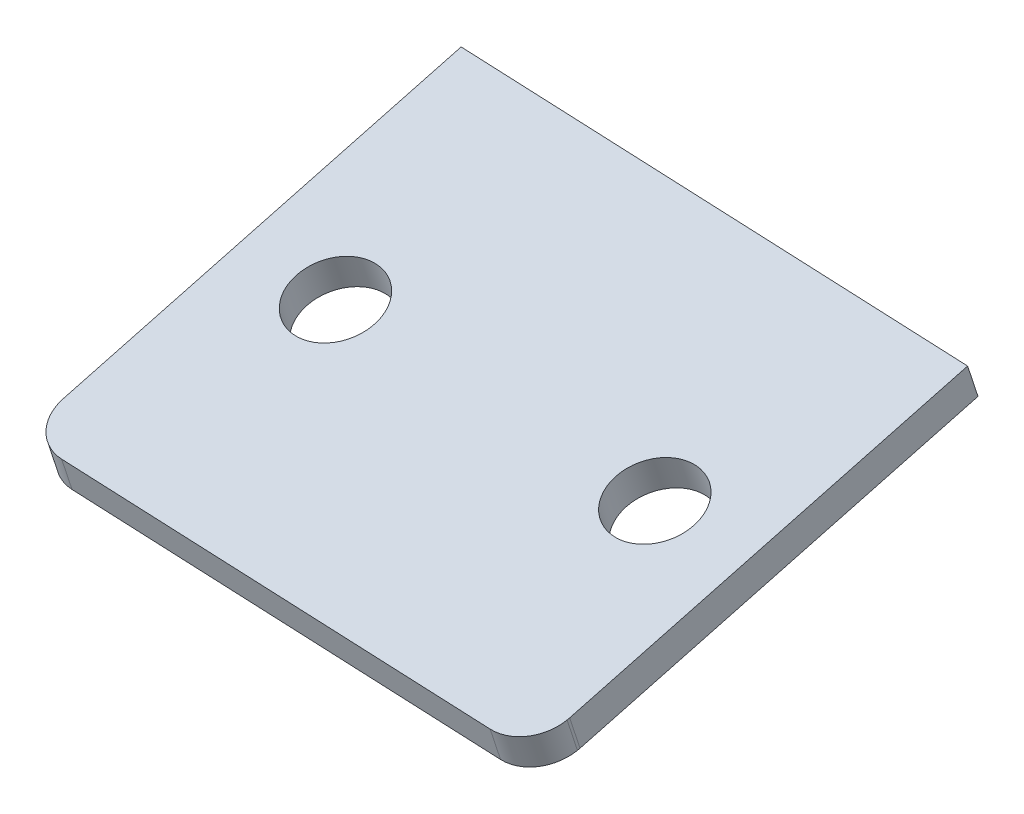
ISO-10303-21;
HEADER;
FILE_DESCRIPTION(('STEP AP214'),'2;1');
FILE_NAME('part.step','',(''),(''),'','','');
FILE_SCHEMA(('AUTOMOTIVE_DESIGN { 1 0 10303 214 1 1 1 1 }'));
ENDSEC;
DATA;
#1=APPLICATION_CONTEXT('core data for automotive mechanical design processes');
#2=APPLICATION_PROTOCOL_DEFINITION('international standard','automotive_design',2000,#1);
#3=PRODUCT_CONTEXT('',#1,'mechanical');
#4=PRODUCT('Part','Part','',(#3));
#5=PRODUCT_RELATED_PRODUCT_CATEGORY('part','',(#4));
#6=PRODUCT_DEFINITION_FORMATION('','',#4);
#7=PRODUCT_DEFINITION_CONTEXT('part definition',#1,'design');
#8=PRODUCT_DEFINITION('design','',#6,#7);
#9=PRODUCT_DEFINITION_SHAPE('','',#8);
#10=(LENGTH_UNIT() NAMED_UNIT(*) SI_UNIT(.MILLI.,.METRE.));
#11=(NAMED_UNIT(*) PLANE_ANGLE_UNIT() SI_UNIT($,.RADIAN.));
#12=(NAMED_UNIT(*) SI_UNIT($,.STERADIAN.) SOLID_ANGLE_UNIT());
#13=UNCERTAINTY_MEASURE_WITH_UNIT(LENGTH_MEASURE(1.E-05),#10,'distance_accuracy_value','');
#14=(GEOMETRIC_REPRESENTATION_CONTEXT(3) GLOBAL_UNCERTAINTY_ASSIGNED_CONTEXT((#13)) GLOBAL_UNIT_ASSIGNED_CONTEXT((#10,
#11,#12)) REPRESENTATION_CONTEXT('',''));
#15=CARTESIAN_POINT('',(0.,0.,0.));
#16=DIRECTION('',(0.,0.,1.));
#17=DIRECTION('',(1.,0.,0.));
#18=AXIS2_PLACEMENT_3D('',#15,#16,#17);
#19=CARTESIAN_POINT('',(20.554989204839,3.72280083406941,2.09203046891583));
#20=DIRECTION('',(0.999048221581858,0.,0.0436193873653291));
#21=DIRECTION('',(0.0436193873653291,0.,-0.999048221581858));
#22=AXIS2_PLACEMENT_3D('',#19,#20,#21);
#23=PLANE('',#22);
#24=DIRECTION('',(0.0415371984691524,0.305273862721688,-0.951358255276273));
#25=VECTOR('',#24,1.);
#26=CARTESIAN_POINT('',(20.5211669233077,6.14155291850395,2.86668807542055));
#27=LINE('',#26,#25);
#28=CARTESIAN_POINT('',(15.8520934976013,-28.1733776143081,109.806051146228));
#29=VERTEX_POINT('',#28);
#30=CARTESIAN_POINT('',(17.1476885624923,-18.6515195073833,80.132045534255));
#31=VERTEX_POINT('',#30);
#32=EDGE_CURVE('E142',#29,#31,#27,.T.);
#33=ORIENTED_EDGE('',*,*,#32,.F.);
#34=DIRECTION('',(-0.0133158588705677,0.952264600171076,0.304983309647527));
#35=VECTOR('',#34,1.);
#36=CARTESIAN_POINT('',(15.8859157791325,-30.5921296987427,109.031393539724));
#37=LINE('',#36,#35);
#38=CARTESIAN_POINT('',(15.8859157791325,-30.5921296987427,109.031393539724));
#39=VERTEX_POINT('',#38);
#40=EDGE_CURVE('E11',#39,#29,#37,.T.);
#41=ORIENTED_EDGE('',*,*,#40,.F.);
#42=DIRECTION('',(0.0415371984691524,0.305273862721688,-0.951358255276273));
#43=VECTOR('',#42,1.);
#44=CARTESIAN_POINT('',(20.554989204839,3.72280083406941,2.09203046891583));
#45=LINE('',#44,#43);
#46=CARTESIAN_POINT('',(17.1815108440235,-21.0702715918179,79.3573879277503));
#47=VERTEX_POINT('',#46);
#48=EDGE_CURVE('E165',#39,#47,#45,.T.);
#49=ORIENTED_EDGE('',*,*,#48,.T.);
#50=DIRECTION('',(-0.0133158588705677,0.952264600171076,0.304983309647527));
#51=VECTOR('',#50,1.);
#52=CARTESIAN_POINT('',(17.1815108440235,-21.0702715918179,79.3573879277503));
#53=LINE('',#52,#51);
#54=EDGE_CURVE('E94',#47,#31,#53,.T.);
#55=ORIENTED_EDGE('',*,*,#54,.T.);
#56=EDGE_LOOP('',(#33,#41,#49,#55));
#57=FACE_BOUND('',#56,.T.);
#58=ADVANCED_FACE('F43',(#57),#23,.T.);
#59=CARTESIAN_POINT('',(23.9557587514666,3.49686451625624,2.94596350866708));
#60=DIRECTION('',(-0.997298898666883,0.0093855284783371,-0.0728479139921318));
#61=DIRECTION('',(-0.0728511227229204,0.,0.997342826673963));
#62=AXIS2_PLACEMENT_3D('',#59,#60,#61);
#63=PLANE('',#62);
#64=DIRECTION('',(-0.0722329192291287,-0.305129551364994,0.949567460617431));
#65=VECTOR('',#64,1.);
#66=CARTESIAN_POINT('',(23.9219364699353,5.91561660069077,3.72062111517179));
#67=LINE('',#66,#65);
#68=CARTESIAN_POINT('',(15.837991585545,-28.2329475464806,109.991433614));
#69=VERTEX_POINT('',#68);
#70=EDGE_CURVE('E145',#29,#69,#67,.T.);
#71=ORIENTED_EDGE('',*,*,#70,.T.);
#72=DIRECTION('',(-0.0133158588705677,0.952264600171076,0.304983309647527));
#73=VECTOR('',#72,1.);
#74=CARTESIAN_POINT('',(15.8718138670763,-30.6516996309152,109.216776007496));
#75=LINE('',#74,#73);
#76=CARTESIAN_POINT('',(15.8718138670763,-30.6516996309152,109.216776007496));
#77=VERTEX_POINT('',#76);
#78=EDGE_CURVE('E51',#77,#69,#75,.T.);
#79=ORIENTED_EDGE('',*,*,#78,.F.);
#80=DIRECTION('',(-0.0722329192291287,-0.305129551364994,0.949567460617431));
#81=VECTOR('',#80,1.);
#82=CARTESIAN_POINT('',(23.9557587514666,3.49686451625624,2.94596350866708));
#83=LINE('',#82,#81);
#84=EDGE_CURVE('E194',#39,#77,#83,.T.);
#85=ORIENTED_EDGE('',*,*,#84,.F.);
#86=ORIENTED_EDGE('',*,*,#40,.T.);
#87=EDGE_LOOP('',(#71,#79,#85,#86));
#88=FACE_BOUND('',#87,.T.);
#89=ADVANCED_FACE('F198',(#88),#63,.F.);
#90=CARTESIAN_POINT('',(12.7139376756101,-30.5921296987426,108.892901984839));
#91=DIRECTION('',(-0.0133158588705677,0.952264600171076,0.304983309647527));
#92=DIRECTION('',(0.,-0.305010351858926,0.952349035416582));
#93=AXIS2_PLACEMENT_3D('',#90,#91,#92);
#94=CYLINDRICAL_SURFACE('',#93,3.175);
#95=CARTESIAN_POINT('',(12.6801153940789,-28.1733776143081,109.667559591343));
#96=DIRECTION('',(0.0133158588705676,-0.952264600171076,-0.304983309647527));
#97=DIRECTION('',(0.,0.305010351858926,-0.952349035416582));
#98=AXIS2_PLACEMENT_3D('',#95,#96,#97);
#99=CIRCLE('',#98,3.175);
#100=CARTESIAN_POINT('',(12.5482347889393,-29.1426221284494,112.688122051846));
#101=VERTEX_POINT('',#100);
#102=EDGE_CURVE('E147',#69,#101,#99,.T.);
#103=ORIENTED_EDGE('',*,*,#102,.T.);
#104=DIRECTION('',(-0.0133158588705677,0.952264600171076,0.304983309647527));
#105=VECTOR('',#104,1.);
#106=CARTESIAN_POINT('',(12.5820570704705,-31.561374212884,111.913464445341));
#107=LINE('',#106,#105);
#108=CARTESIAN_POINT('',(12.5820570704705,-31.561374212884,111.913464445341));
#109=VERTEX_POINT('',#108);
#110=EDGE_CURVE('E171',#109,#101,#107,.T.);
#111=ORIENTED_EDGE('',*,*,#110,.F.);
#112=CARTESIAN_POINT('',(12.7139376756101,-30.5921296987426,108.892901984839));
#113=DIRECTION('',(0.0133158588705676,-0.952264600171076,-0.304983309647527));
#114=DIRECTION('',(0.,0.305010351858926,-0.952349035416582));
#115=AXIS2_PLACEMENT_3D('',#112,#113,#114);
#116=CIRCLE('',#115,3.175);
#117=EDGE_CURVE('E180',#77,#109,#116,.T.);
#118=ORIENTED_EDGE('',*,*,#117,.F.);
#119=ORIENTED_EDGE('',*,*,#78,.T.);
#120=EDGE_LOOP('',(#103,#111,#118,#119));
#121=FACE_BOUND('',#120,.T.);
#122=ADVANCED_FACE('F178',(#121),#94,.T.);
#123=CARTESIAN_POINT('',(-4.85301129570791,-31.561374212884,111.152232920799));
#124=DIRECTION('',(0.0415371984691527,0.305273862721688,-0.951358255276273));
#125=DIRECTION('',(0.,0.952180026486865,0.305537554417576));
#126=AXIS2_PLACEMENT_3D('',#123,#124,#125);
#127=PLANE('',#126);
#128=DIRECTION('',(-0.999048221581858,0.,-0.0436193873653294));
#129=VECTOR('',#128,1.);
#130=CARTESIAN_POINT('',(-4.88683357723916,-29.1426221284494,111.926890527304));
#131=LINE('',#130,#129);
#132=CARTESIAN_POINT('',(-22.3219019434176,-29.1426221284494,111.165659002762));
#133=VERTEX_POINT('',#132);
#134=EDGE_CURVE('E149',#101,#133,#131,.T.);
#135=ORIENTED_EDGE('',*,*,#134,.T.);
#136=DIRECTION('',(-0.0133158588705677,0.952264600171076,0.304983309647527));
#137=VECTOR('',#136,1.);
#138=CARTESIAN_POINT('',(-22.2880796618863,-31.561374212884,110.391001396258));
#139=LINE('',#138,#137);
#140=CARTESIAN_POINT('',(-22.2880796618863,-31.561374212884,110.391001396258));
#141=VERTEX_POINT('',#140);
#142=EDGE_CURVE('E169',#141,#133,#139,.T.);
#143=ORIENTED_EDGE('',*,*,#142,.F.);
#144=DIRECTION('',(-0.999048221581858,0.,-0.0436193873653294));
#145=VECTOR('',#144,1.);
#146=CARTESIAN_POINT('',(-4.85301129570791,-31.561374212884,111.152232920799));
#147=LINE('',#146,#145);
#148=EDGE_CURVE('E192',#109,#141,#147,.T.);
#149=ORIENTED_EDGE('',*,*,#148,.F.);
#150=ORIENTED_EDGE('',*,*,#110,.T.);
#151=EDGE_LOOP('',(#135,#143,#149,#150));
#152=FACE_BOUND('',#151,.T.);
#153=ADVANCED_FACE('F190',(#152),#127,.F.);
#154=CARTESIAN_POINT('',(-22.1561990567468,-30.5921296987426,107.370438935755));
#155=DIRECTION('',(-0.0133158588705677,0.952264600171076,0.304983309647527));
#156=DIRECTION('',(0.,-0.305010351858926,0.952349035416582));
#157=AXIS2_PLACEMENT_3D('',#154,#155,#156);
#158=CYLINDRICAL_SURFACE('',#157,3.175);
#159=CARTESIAN_POINT('',(-22.190021338278,-28.1733776143081,108.14509654226));
#160=DIRECTION('',(0.0133158588705676,-0.952264600171076,-0.304983309647527));
#161=DIRECTION('',(0.,0.305010351858926,-0.952349035416582));
#162=AXIS2_PLACEMENT_3D('',#159,#160,#161);
#163=CIRCLE('',#162,3.175);
#164=CARTESIAN_POINT('',(-25.3641083384481,-28.2329475464808,108.192511081509));
#165=VERTEX_POINT('',#164);
#166=EDGE_CURVE('E152',#165,#133,#163,.F.);
#167=ORIENTED_EDGE('',*,*,#166,.F.);
#168=DIRECTION('',(-0.0133158588705677,0.952264600171076,0.304983309647527));
#169=VECTOR('',#168,1.);
#170=CARTESIAN_POINT('',(-25.3302860569168,-30.6516996309153,107.417853475004));
#171=LINE('',#170,#169);
#172=CARTESIAN_POINT('',(-25.3302860569168,-30.6516996309153,107.417853475004));
#173=VERTEX_POINT('',#172);
#174=EDGE_CURVE('E128',#173,#165,#171,.T.);
#175=ORIENTED_EDGE('',*,*,#174,.F.);
#176=CARTESIAN_POINT('',(-22.1561990567468,-30.5921296987426,107.370438935755));
#177=DIRECTION('',(0.0133158588705676,-0.952264600171076,-0.304983309647527));
#178=DIRECTION('',(0.,0.305010351858926,-0.952349035416582));
#179=AXIS2_PLACEMENT_3D('',#176,#177,#178);
#180=CIRCLE('',#179,3.175);
#181=EDGE_CURVE('E121',#173,#141,#180,.F.);
#182=ORIENTED_EDGE('',*,*,#181,.T.);
#183=ORIENTED_EDGE('',*,*,#142,.T.);
#184=EDGE_LOOP('',(#167,#175,#182,#183));
#185=FACE_BOUND('',#184,.T.);
#186=ADVANCED_FACE('F209',(#185),#158,.T.);
#187=CARTESIAN_POINT('',(-24.1213574946813,3.49686451625624,0.846871281038447));
#188=DIRECTION('',(0.999852989316288,0.00938552847833725,0.0143496205687147));
#189=DIRECTION('',(0.0143502526262,0.,-0.999897029823353));
#190=AXIS2_PLACEMENT_3D('',#187,#188,#189);
#191=PLANE('',#190);
#192=DIRECTION('',(0.0108022061553594,0.305129551364994,-0.952249583473773));
#193=VECTOR('',#192,1.);
#194=CARTESIAN_POINT('',(-24.1551797762125,5.91561660069077,1.62152888754317));
#195=LINE('',#194,#193);
#196=CARTESIAN_POINT('',(-25.3619994418004,-28.173377614308,108.006604987375));
#197=VERTEX_POINT('',#196);
#198=EDGE_CURVE('E127',#165,#197,#195,.T.);
#199=ORIENTED_EDGE('',*,*,#198,.T.);
#200=DIRECTION('',(-0.0133158588705677,0.952264600171076,0.304983309647527));
#201=VECTOR('',#200,1.);
#202=CARTESIAN_POINT('',(-25.3281771602691,-30.5921296987425,107.23194738087));
#203=LINE('',#202,#201);
#204=CARTESIAN_POINT('',(-25.3281771602691,-30.5921296987425,107.23194738087));
#205=VERTEX_POINT('',#204);
#206=EDGE_CURVE('E124',#205,#197,#203,.T.);
#207=ORIENTED_EDGE('',*,*,#206,.F.);
#208=DIRECTION('',(0.0108022061553594,0.305129551364994,-0.952249583473773));
#209=VECTOR('',#208,1.);
#210=CARTESIAN_POINT('',(-24.1213574946813,3.49686451625624,0.846871281038447));
#211=LINE('',#210,#209);
#212=EDGE_CURVE('E114',#173,#205,#211,.T.);
#213=ORIENTED_EDGE('',*,*,#212,.F.);
#214=ORIENTED_EDGE('',*,*,#174,.T.);
#215=EDGE_LOOP('',(#199,#207,#213,#214));
#216=FACE_BOUND('',#215,.T.);
#217=ADVANCED_FACE('F125',(#216),#191,.F.);
#218=CARTESIAN_POINT('',(-20.6591037345627,3.72280083406941,0.292584310062797));
#219=DIRECTION('',(0.999048221581858,0.,0.043619387365329));
#220=DIRECTION('',(0.043619387365329,0.,-0.999048221581858));
#221=AXIS2_PLACEMENT_3D('',#218,#219,#220);
#222=PLANE('',#221);
#223=DIRECTION('',(0.0415371984691523,0.305273862721688,-0.951358255276273));
#224=VECTOR('',#223,1.);
#225=CARTESIAN_POINT('',(-20.692926016094,6.14155291850394,1.06724191656752));
#226=LINE('',#225,#224);
#227=CARTESIAN_POINT('',(-24.0664043769094,-18.6515195073833,78.332599375402));
#228=VERTEX_POINT('',#227);
#229=EDGE_CURVE('E87',#197,#228,#226,.T.);
#230=ORIENTED_EDGE('',*,*,#229,.T.);
#231=DIRECTION('',(-0.0133158588705677,0.952264600171076,0.304983309647527));
#232=VECTOR('',#231,1.);
#233=CARTESIAN_POINT('',(-24.0325820953781,-21.0702715918179,77.5579417688973));
#234=LINE('',#233,#232);
#235=CARTESIAN_POINT('',(-24.0325820953781,-21.0702715918179,77.5579417688973));
#236=VERTEX_POINT('',#235);
#237=EDGE_CURVE('E129',#236,#228,#234,.T.);
#238=ORIENTED_EDGE('',*,*,#237,.F.);
#239=DIRECTION('',(0.0415371984691523,0.305273862721688,-0.951358255276273));
#240=VECTOR('',#239,1.);
#241=CARTESIAN_POINT('',(-20.6591037345627,3.72280083406941,0.292584310062797));
#242=LINE('',#241,#240);
#243=EDGE_CURVE('E119',#205,#236,#242,.T.);
#244=ORIENTED_EDGE('',*,*,#243,.F.);
#245=ORIENTED_EDGE('',*,*,#206,.T.);
#246=EDGE_LOOP('',(#230,#238,#244,#245));
#247=FACE_BOUND('',#246,.T.);
#248=ADVANCED_FACE('F131',(#247),#222,.F.);
#249=CARTESIAN_POINT('',(-17.1335724819397,-26.3158229023509,94.2376055368587));
#250=DIRECTION('',(-0.0133158588705677,0.952264600171076,0.304983309647527));
#251=DIRECTION('',(0.,-0.305010351858926,0.952349035416582));
#252=AXIS2_PLACEMENT_3D('',#249,#250,#251);
#253=CYLINDRICAL_SURFACE('',#252,3.175);
#254=CARTESIAN_POINT('',(-17.1335724819397,-26.3158229023509,94.2376055368587));
#255=DIRECTION('',(0.0133158588705676,-0.952264600171076,-0.304983309647527));
#256=DIRECTION('',(0.,0.305010351858926,-0.952349035416582));
#257=AXIS2_PLACEMENT_3D('',#254,#255,#256);
#258=CIRCLE('',#257,3.175);
#259=CARTESIAN_POINT('',(-17.1335724819397,-27.284230769503,97.2613137243063));
#260=VERTEX_POINT('',#259);
#261=EDGE_CURVE('E133',#260,#260,#258,.T.);
#262=CARTESIAN_POINT('',(-17.1673947634709,-23.8970708179164,95.0122631433634));
#263=DIRECTION('',(0.0133158588705676,-0.952264600171076,-0.304983309647527));
#264=DIRECTION('',(0.,0.305010351858926,-0.952349035416582));
#265=AXIS2_PLACEMENT_3D('',#262,#263,#264);
#266=CIRCLE('',#265,3.175);
#267=CARTESIAN_POINT('',(-17.1673947634709,-24.8654786850684,98.0359713308111));
#268=VERTEX_POINT('',#267);
#269=EDGE_CURVE('E159',#268,#268,#266,.T.);
#270=CARTESIAN_POINT('',(-17.1335724819397,-27.284230769503,97.2613137243063));
#271=CARTESIAN_POINT('',(-17.1339247973723,-27.2590354352901,97.2693830743741));
#272=CARTESIAN_POINT('',(-17.1342771128049,-27.2338401010773,97.2774524244419));
#273=CARTESIAN_POINT('',(-17.1349817436701,-27.1834494326515,97.2935911245774));
#274=CARTESIAN_POINT('',(-17.1353340591027,-27.1582540984387,97.3016604746451));
#275=CARTESIAN_POINT('',(-17.136038689968,-27.107863430013,97.3177991747807));
#276=CARTESIAN_POINT('',(-17.1363910054006,-27.0826680958001,97.3258685248484));
#277=CARTESIAN_POINT('',(-17.1370956362658,-27.0322774273744,97.3420072249839));
#278=CARTESIAN_POINT('',(-17.1374479516984,-27.0070820931615,97.3500765750517));
#279=CARTESIAN_POINT('',(-17.1381525825637,-26.9566914247358,97.3662152751872));
#280=CARTESIAN_POINT('',(-17.1385048979963,-26.9314960905229,97.374284625255));
#281=CARTESIAN_POINT('',(-17.1392095288615,-26.8811054220972,97.3904233253905));
#282=CARTESIAN_POINT('',(-17.1395618442941,-26.8559100878844,97.3984926754582));
#283=CARTESIAN_POINT('',(-17.1402664751594,-26.8055194194586,97.4146313755937));
#284=CARTESIAN_POINT('',(-17.140618790592,-26.7803240852458,97.4227007256615));
#285=CARTESIAN_POINT('',(-17.1413234214572,-26.7299334168201,97.438839425797));
#286=CARTESIAN_POINT('',(-17.1416757368899,-26.7047380826072,97.4469087758648));
#287=CARTESIAN_POINT('',(-17.1423803677551,-26.6543474141815,97.4630474760003));
#288=CARTESIAN_POINT('',(-17.1427326831877,-26.6291520799686,97.471116826068));
#289=CARTESIAN_POINT('',(-17.1434373140529,-26.5787614115429,97.4872555262036));
#290=CARTESIAN_POINT('',(-17.1437896294855,-26.5535660773301,97.4953248762713));
#291=CARTESIAN_POINT('',(-17.1444942603508,-26.5031754089043,97.5114635764068));
#292=CARTESIAN_POINT('',(-17.1448465757834,-26.4779800746915,97.5195329264746));
#293=CARTESIAN_POINT('',(-17.1455512066486,-26.4275894062658,97.5356716266101));
#294=CARTESIAN_POINT('',(-17.1459035220813,-26.4023940720529,97.5437409766779));
#295=CARTESIAN_POINT('',(-17.1466081529465,-26.3520034036272,97.5598796768134));
#296=CARTESIAN_POINT('',(-17.1469604683791,-26.3268080694143,97.5679490268811));
#297=CARTESIAN_POINT('',(-17.1476650992443,-26.2764174009886,97.5840877270167));
#298=CARTESIAN_POINT('',(-17.148017414677,-26.2512220667757,97.5921570770844));
#299=CARTESIAN_POINT('',(-17.1487220455422,-26.20083139835,97.6082957772199));
#300=CARTESIAN_POINT('',(-17.1490743609748,-26.1756360641372,97.6163651272877));
#301=CARTESIAN_POINT('',(-17.14977899184,-26.1252453957114,97.6325038274232));
#302=CARTESIAN_POINT('',(-17.1501313072727,-26.1000500614986,97.640573177491));
#303=CARTESIAN_POINT('',(-17.1508359381379,-26.0496593930729,97.6567118776265));
#304=CARTESIAN_POINT('',(-17.1511882535705,-26.02446405886,97.6647812276942));
#305=CARTESIAN_POINT('',(-17.1518928844357,-25.9740733904343,97.6809199278297));
#306=CARTESIAN_POINT('',(-17.1522451998684,-25.9488780562214,97.6889892778975));
#307=CARTESIAN_POINT('',(-17.1529498307336,-25.8984873877957,97.705127978033));
#308=CARTESIAN_POINT('',(-17.1533021461662,-25.8732920535828,97.7131973281008));
#309=CARTESIAN_POINT('',(-17.1540067770314,-25.8229013851571,97.7293360282363));
#310=CARTESIAN_POINT('',(-17.1543590924641,-25.7977060509443,97.7374053783041));
#311=CARTESIAN_POINT('',(-17.1550637233293,-25.7473153825185,97.7535440784396));
#312=CARTESIAN_POINT('',(-17.1554160387619,-25.7221200483057,97.7616134285073));
#313=CARTESIAN_POINT('',(-17.1561206696271,-25.67172937988,97.7777521286428));
#314=CARTESIAN_POINT('',(-17.1564729850598,-25.6465340456671,97.7858214787106));
#315=CARTESIAN_POINT('',(-17.157177615925,-25.5961433772414,97.8019601788461));
#316=CARTESIAN_POINT('',(-17.1575299313576,-25.5709480430285,97.8100295289139));
#317=CARTESIAN_POINT('',(-17.1582345622228,-25.5205573746028,97.8261682290494));
#318=CARTESIAN_POINT('',(-17.1585868776555,-25.4953620403899,97.8342375791171));
#319=CARTESIAN_POINT('',(-17.1592915085207,-25.4449713719642,97.8503762792527));
#320=CARTESIAN_POINT('',(-17.1596438239533,-25.4197760377514,97.8584456293204));
#321=CARTESIAN_POINT('',(-17.1603484548186,-25.3693853693256,97.8745843294559));
#322=CARTESIAN_POINT('',(-17.1607007702512,-25.3441900351128,97.8826536795237));
#323=CARTESIAN_POINT('',(-17.1614054011164,-25.2937993666871,97.8987923796592));
#324=CARTESIAN_POINT('',(-17.161757716549,-25.2686040324742,97.906861729727));
#325=CARTESIAN_POINT('',(-17.1624623474143,-25.2182133640485,97.9230004298625));
#326=CARTESIAN_POINT('',(-17.1628146628469,-25.1930180298356,97.9310697799302));
#327=CARTESIAN_POINT('',(-17.1635192937121,-25.1426273614099,97.9472084800657));
#328=CARTESIAN_POINT('',(-17.1638716091447,-25.117432027197,97.9552778301335));
#329=CARTESIAN_POINT('',(-17.16457624001,-25.0670413587713,97.971416530269));
#330=CARTESIAN_POINT('',(-17.1649285554426,-25.0418460245585,97.9794858803368));
#331=CARTESIAN_POINT('',(-17.1656331863078,-24.9914553561327,97.9956245804723));
#332=CARTESIAN_POINT('',(-17.1659855017404,-24.9662600219199,98.0036939305401));
#333=CARTESIAN_POINT('',(-17.1666901326057,-24.9158693534942,98.0198326306756));
#334=CARTESIAN_POINT('',(-17.1670424480383,-24.8906740192813,98.0279019807433));
#335=CARTESIAN_POINT('',(-17.1673947634709,-24.8654786850684,98.0359713308111));
#336=B_SPLINE_CURVE_WITH_KNOTS('',3,(#270,#271,#272,#273,#274,#275,#276,#277,#278,#279,#280,
#281,#282,#283,#284,#285,#286,#287,#288,#289,#290,#291,#292,#293,#294,#295,#296,#297,#298,#299,
#300,#301,#302,#303,#304,#305,#306,#307,#308,#309,#310,#311,#312,#313,#314,#315,#316,#317,#318,
#319,#320,#321,#322,#323,#324,#325,#326,#327,#328,#329,#330,#331,#332,#333,#334,#335),
.UNSPECIFIED.,.F.,.F.,(4,2,2,2,2,2,2,2,2,2,2,2,2,2,2,2,2,2,2,2,2,2,2,2,2,2,2,2,2,2,2,2,4),(0.,
0.0793749999999961,0.158749999999995,0.238124999999999,0.317499999999998,0.396874999999998,
0.476249999999997,0.555624999999997,0.634999999999996,0.714375,0.793749999999999,
0.873124999999998,0.952499999999998,1.031875,1.11125,1.190625,1.27,1.349375,1.42875,1.508125,
1.5875,1.666875,1.74625,1.825625,1.905,1.984375,2.06375,2.143125,2.2225,2.301875,2.38125,
2.460625,2.54),.UNSPECIFIED.);
#337=EDGE_CURVE('BSEAM217',#260,#268,#336,.T.);
#338=ORIENTED_EDGE('',*,*,#261,.T.);
#339=ORIENTED_EDGE('',*,*,#269,.F.);
#340=ORIENTED_EDGE('',*,*,#337,.T.);
#341=ORIENTED_EDGE('',*,*,#337,.F.);
#342=EDGE_LOOP('',(#338,#340,#339,#341));
#343=FACE_BOUND('',#342,.T.);
#344=ADVANCED_FACE('F217',(#343),#253,.F.);
#345=CARTESIAN_POINT('',(-3.42553562567729,-21.0702715918179,78.4576648483238));
#346=DIRECTION('',(-0.0415371984691523,-0.305273862721688,0.951358255276273));
#347=DIRECTION('',(0.,-0.952180026486865,-0.305537554417576));
#348=AXIS2_PLACEMENT_3D('',#345,#346,#347);
#349=PLANE('',#348);
#350=DIRECTION('',(0.999048221581858,0.,0.043619387365329));
#351=VECTOR('',#350,1.);
#352=CARTESIAN_POINT('',(-3.45935790720853,-18.6515195073833,79.2323224548285));
#353=LINE('',#352,#351);
#354=EDGE_CURVE('E157',#228,#31,#353,.T.);
#355=ORIENTED_EDGE('',*,*,#354,.T.);
#356=ORIENTED_EDGE('',*,*,#54,.F.);
#357=DIRECTION('',(0.999048221581858,0.,0.043619387365329));
#358=VECTOR('',#357,1.);
#359=CARTESIAN_POINT('',(-3.42553562567729,-21.0702715918179,78.4576648483238));
#360=LINE('',#359,#358);
#361=EDGE_CURVE('E59',#236,#47,#360,.T.);
#362=ORIENTED_EDGE('',*,*,#361,.F.);
#363=ORIENTED_EDGE('',*,*,#237,.T.);
#364=EDGE_LOOP('',(#355,#356,#362,#363));
#365=FACE_BOUND('',#364,.T.);
#366=ADVANCED_FACE('F218',(#365),#349,.F.);
#367=CARTESIAN_POINT('',(8.85502556055448,-26.3158229023509,95.3722922322641));
#368=DIRECTION('',(-0.0133158588705677,0.952264600171076,0.304983309647527));
#369=DIRECTION('',(0.,-0.305010351858926,0.952349035416582));
#370=AXIS2_PLACEMENT_3D('',#367,#368,#369);
#371=CYLINDRICAL_SURFACE('',#370,3.175);
#372=CARTESIAN_POINT('',(8.85502556055448,-26.3158229023509,95.3722922322641));
#373=DIRECTION('',(0.0133158588705676,-0.952264600171076,-0.304983309647527));
#374=DIRECTION('',(0.,0.305010351858926,-0.952349035416582));
#375=AXIS2_PLACEMENT_3D('',#372,#373,#374);
#376=CIRCLE('',#375,3.175);
#377=CARTESIAN_POINT('',(8.85502556055448,-27.284230769503,98.3960004197118));
#378=VERTEX_POINT('',#377);
#379=EDGE_CURVE('E139',#378,#378,#376,.F.);
#380=CARTESIAN_POINT('',(8.82120327902324,-23.8970708179164,96.1469498387688));
#381=DIRECTION('',(0.0133158588705676,-0.952264600171076,-0.304983309647527));
#382=DIRECTION('',(0.,0.305010351858926,-0.952349035416582));
#383=AXIS2_PLACEMENT_3D('',#380,#381,#382);
#384=CIRCLE('',#383,3.175);
#385=CARTESIAN_POINT('',(8.82120327902324,-24.8654786850684,99.1706580262165));
#386=VERTEX_POINT('',#385);
#387=EDGE_CURVE('E162',#386,#386,#384,.F.);
#388=CARTESIAN_POINT('',(8.85502556055448,-27.284230769503,98.3960004197118));
#389=CARTESIAN_POINT('',(8.85467324512186,-27.2590354352901,98.4040697697795));
#390=CARTESIAN_POINT('',(8.85432092968925,-27.2338401010773,98.4121391198473));
#391=CARTESIAN_POINT('',(8.85361629882401,-27.1834494326515,98.4282778199828));
#392=CARTESIAN_POINT('',(8.8532639833914,-27.1582540984387,98.4363471700506));
#393=CARTESIAN_POINT('',(8.85255935252616,-27.107863430013,98.4524858701861));
#394=CARTESIAN_POINT('',(8.85220703709355,-27.0826680958001,98.4605552202538));
#395=CARTESIAN_POINT('',(8.85150240622831,-27.0322774273744,98.4766939203894));
#396=CARTESIAN_POINT('',(8.85115009079569,-27.0070820931615,98.4847632704571));
#397=CARTESIAN_POINT('',(8.85044545993046,-26.9566914247358,98.5009019705926));
#398=CARTESIAN_POINT('',(8.85009314449784,-26.9314960905229,98.5089713206604));
#399=CARTESIAN_POINT('',(8.84938851363261,-26.8811054220972,98.5251100207959));
#400=CARTESIAN_POINT('',(8.84903619819999,-26.8559100878844,98.5331793708637));
#401=CARTESIAN_POINT('',(8.84833156733476,-26.8055194194586,98.5493180709992));
#402=CARTESIAN_POINT('',(8.84797925190214,-26.7803240852458,98.5573874210669));
#403=CARTESIAN_POINT('',(8.84727462103691,-26.7299334168201,98.5735261212024));
#404=CARTESIAN_POINT('',(8.84692230560429,-26.7047380826072,98.5815954712702));
#405=CARTESIAN_POINT('',(8.84621767473906,-26.6543474141815,98.5977341714057));
#406=CARTESIAN_POINT('',(8.84586535930644,-26.6291520799686,98.6058035214735));
#407=CARTESIAN_POINT('',(8.8451607284412,-26.5787614115429,98.621942221609));
#408=CARTESIAN_POINT('',(8.84480841300859,-26.5535660773301,98.6300115716767));
#409=CARTESIAN_POINT('',(8.84410378214335,-26.5031754089043,98.6461502718123));
#410=CARTESIAN_POINT('',(8.84375146671073,-26.4779800746915,98.65421962188));
#411=CARTESIAN_POINT('',(8.8430468358455,-26.4275894062658,98.6703583220155));
#412=CARTESIAN_POINT('',(8.84269452041288,-26.4023940720529,98.6784276720833));
#413=CARTESIAN_POINT('',(8.84198988954765,-26.3520034036272,98.6945663722188));
#414=CARTESIAN_POINT('',(8.84163757411503,-26.3268080694143,98.7026357222865));
#415=CARTESIAN_POINT('',(8.8409329432498,-26.2764174009886,98.7187744224221));
#416=CARTESIAN_POINT('',(8.84058062781718,-26.2512220667757,98.7268437724898));
#417=CARTESIAN_POINT('',(8.83987599695195,-26.20083139835,98.7429824726254));
#418=CARTESIAN_POINT('',(8.83952368151933,-26.1756360641372,98.7510518226931));
#419=CARTESIAN_POINT('',(8.8388190506541,-26.1252453957114,98.7671905228286));
#420=CARTESIAN_POINT('',(8.83846673522148,-26.1000500614986,98.7752598728964));
#421=CARTESIAN_POINT('',(8.83776210435624,-26.0496593930729,98.7913985730319));
#422=CARTESIAN_POINT('',(8.83740978892363,-26.02446405886,98.7994679230997));
#423=CARTESIAN_POINT('',(8.83670515805839,-25.9740733904343,98.8156066232352));
#424=CARTESIAN_POINT('',(8.83635284262578,-25.9488780562214,98.8236759733029));
#425=CARTESIAN_POINT('',(8.83564821176054,-25.8984873877957,98.8398146734384));
#426=CARTESIAN_POINT('',(8.83529589632792,-25.8732920535828,98.8478840235062));
#427=CARTESIAN_POINT('',(8.83459126546269,-25.8229013851571,98.8640227236417));
#428=CARTESIAN_POINT('',(8.83423895003007,-25.7977060509443,98.8720920737095));
#429=CARTESIAN_POINT('',(8.83353431916484,-25.7473153825185,98.888230773845));
#430=CARTESIAN_POINT('',(8.83318200373222,-25.7221200483057,98.8963001239128));
#431=CARTESIAN_POINT('',(8.83247737286699,-25.67172937988,98.9124388240483));
#432=CARTESIAN_POINT('',(8.83212505743437,-25.6465340456671,98.920508174116));
#433=CARTESIAN_POINT('',(8.83142042656914,-25.5961433772414,98.9366468742515));
#434=CARTESIAN_POINT('',(8.83106811113652,-25.5709480430285,98.9447162243193));
#435=CARTESIAN_POINT('',(8.83036348027129,-25.5205573746028,98.9608549244548));
#436=CARTESIAN_POINT('',(8.83001116483867,-25.4953620403899,98.9689242745225));
#437=CARTESIAN_POINT('',(8.82930653397344,-25.4449713719642,98.9850629746581));
#438=CARTESIAN_POINT('',(8.82895421854082,-25.4197760377514,98.9931323247258));
#439=CARTESIAN_POINT('',(8.82824958767558,-25.3693853693256,99.0092710248614));
#440=CARTESIAN_POINT('',(8.82789727224296,-25.3441900351128,99.0173403749291));
#441=CARTESIAN_POINT('',(8.82719264137773,-25.2937993666871,99.0334790750646));
#442=CARTESIAN_POINT('',(8.82684032594511,-25.2686040324742,99.0415484251324));
#443=CARTESIAN_POINT('',(8.82613569507988,-25.2182133640485,99.0576871252679));
#444=CARTESIAN_POINT('',(8.82578337964726,-25.1930180298356,99.0657564753356));
#445=CARTESIAN_POINT('',(8.82507874878203,-25.1426273614099,99.0818951754712));
#446=CARTESIAN_POINT('',(8.82472643334941,-25.117432027197,99.0899645255389));
#447=CARTESIAN_POINT('',(8.82402180248418,-25.0670413587713,99.1061032256744));
#448=CARTESIAN_POINT('',(8.82366948705156,-25.0418460245585,99.1141725757422));
#449=CARTESIAN_POINT('',(8.82296485618633,-24.9914553561327,99.1303112758777));
#450=CARTESIAN_POINT('',(8.82261254075371,-24.9662600219199,99.1383806259455));
#451=CARTESIAN_POINT('',(8.82190790988848,-24.9158693534942,99.154519326081));
#452=CARTESIAN_POINT('',(8.82155559445586,-24.8906740192813,99.1625886761487));
#453=CARTESIAN_POINT('',(8.82120327902324,-24.8654786850684,99.1706580262165));
#454=B_SPLINE_CURVE_WITH_KNOTS('',3,(#388,#389,#390,#391,#392,#393,#394,#395,#396,#397,#398,
#399,#400,#401,#402,#403,#404,#405,#406,#407,#408,#409,#410,#411,#412,#413,#414,#415,#416,#417,
#418,#419,#420,#421,#422,#423,#424,#425,#426,#427,#428,#429,#430,#431,#432,#433,#434,#435,#436,
#437,#438,#439,#440,#441,#442,#443,#444,#445,#446,#447,#448,#449,#450,#451,#452,#453),
.UNSPECIFIED.,.F.,.F.,(4,2,2,2,2,2,2,2,2,2,2,2,2,2,2,2,2,2,2,2,2,2,2,2,2,2,2,2,2,2,2,2,4),(0.,
0.0793749999999961,0.158749999999995,0.238124999999999,0.317499999999998,0.396874999999998,
0.476249999999997,0.555624999999997,0.634999999999996,0.714375,0.793749999999999,
0.873124999999998,0.952499999999998,1.031875,1.11125,1.190625,1.27,1.349375,1.42875,1.508125,
1.5875,1.666875,1.74625,1.825625,1.905,1.984375,2.06375,2.143125,2.2225,2.301875,2.38125,
2.460625,2.54),.UNSPECIFIED.);
#455=EDGE_CURVE('BSEAM221',#378,#386,#454,.T.);
#456=ORIENTED_EDGE('',*,*,#379,.F.);
#457=ORIENTED_EDGE('',*,*,#387,.T.);
#458=ORIENTED_EDGE('',*,*,#455,.T.);
#459=ORIENTED_EDGE('',*,*,#455,.F.);
#460=EDGE_LOOP('',(#456,#458,#457,#459));
#461=FACE_BOUND('',#460,.T.);
#462=ADVANCED_FACE('F221',(#461),#371,.F.);
#463=CARTESIAN_POINT('',(-0.0520572648618815,3.72280083406941,1.19230738948932));
#464=DIRECTION('',(0.0133158588705676,-0.952264600171076,-0.304983309647527));
#465=DIRECTION('',(0.,0.305010351858926,-0.952349035416582));
#466=AXIS2_PLACEMENT_3D('',#463,#464,#465);
#467=PLANE('',#466);
#468=ORIENTED_EDGE('',*,*,#48,.F.);
#469=ORIENTED_EDGE('',*,*,#84,.T.);
#470=ORIENTED_EDGE('',*,*,#117,.T.);
#471=ORIENTED_EDGE('',*,*,#148,.T.);
#472=ORIENTED_EDGE('',*,*,#181,.F.);
#473=ORIENTED_EDGE('',*,*,#212,.T.);
#474=ORIENTED_EDGE('',*,*,#243,.T.);
#475=ORIENTED_EDGE('',*,*,#361,.T.);
#476=EDGE_LOOP('',(#468,#469,#470,#471,#472,#473,#474,#475));
#477=FACE_BOUND('',#476,.T.);
#478=ORIENTED_EDGE('',*,*,#261,.F.);
#479=EDGE_LOOP('',(#478));
#480=FACE_BOUND('',#479,.T.);
#481=ORIENTED_EDGE('',*,*,#379,.T.);
#482=EDGE_LOOP('',(#481));
#483=FACE_BOUND('',#482,.T.);
#484=ADVANCED_FACE('F116',(#477,#480,#483),#467,.T.);
#485=CARTESIAN_POINT('',(-0.0858795463931235,6.14155291850395,1.96696499599403));
#486=DIRECTION('',(0.0133158588705676,-0.952264600171076,-0.304983309647527));
#487=DIRECTION('',(0.,0.305010351858926,-0.952349035416582));
#488=AXIS2_PLACEMENT_3D('',#485,#486,#487);
#489=PLANE('',#488);
#490=ORIENTED_EDGE('',*,*,#32,.T.);
#491=ORIENTED_EDGE('',*,*,#354,.F.);
#492=ORIENTED_EDGE('',*,*,#229,.F.);
#493=ORIENTED_EDGE('',*,*,#198,.F.);
#494=ORIENTED_EDGE('',*,*,#166,.T.);
#495=ORIENTED_EDGE('',*,*,#134,.F.);
#496=ORIENTED_EDGE('',*,*,#102,.F.);
#497=ORIENTED_EDGE('',*,*,#70,.F.);
#498=EDGE_LOOP('',(#490,#491,#492,#493,#494,#495,#496,#497));
#499=FACE_BOUND('',#498,.T.);
#500=ORIENTED_EDGE('',*,*,#269,.T.);
#501=EDGE_LOOP('',(#500));
#502=FACE_BOUND('',#501,.T.);
#503=ORIENTED_EDGE('',*,*,#387,.F.);
#504=EDGE_LOOP('',(#503));
#505=FACE_BOUND('',#504,.T.);
#506=ADVANCED_FACE('F185',(#499,#502,#505),#489,.F.);
#507=CLOSED_SHELL('',(#58,#89,#122,#153,#186,#217,#248,#344,#366,#462,#484,#506));
#508=MANIFOLD_SOLID_BREP('B2',#507);
#509=ADVANCED_BREP_SHAPE_REPRESENTATION('',(#18,#508),#14);
#510=SHAPE_DEFINITION_REPRESENTATION(#9,#509);
ENDSEC;
END-ISO-10303-21;
